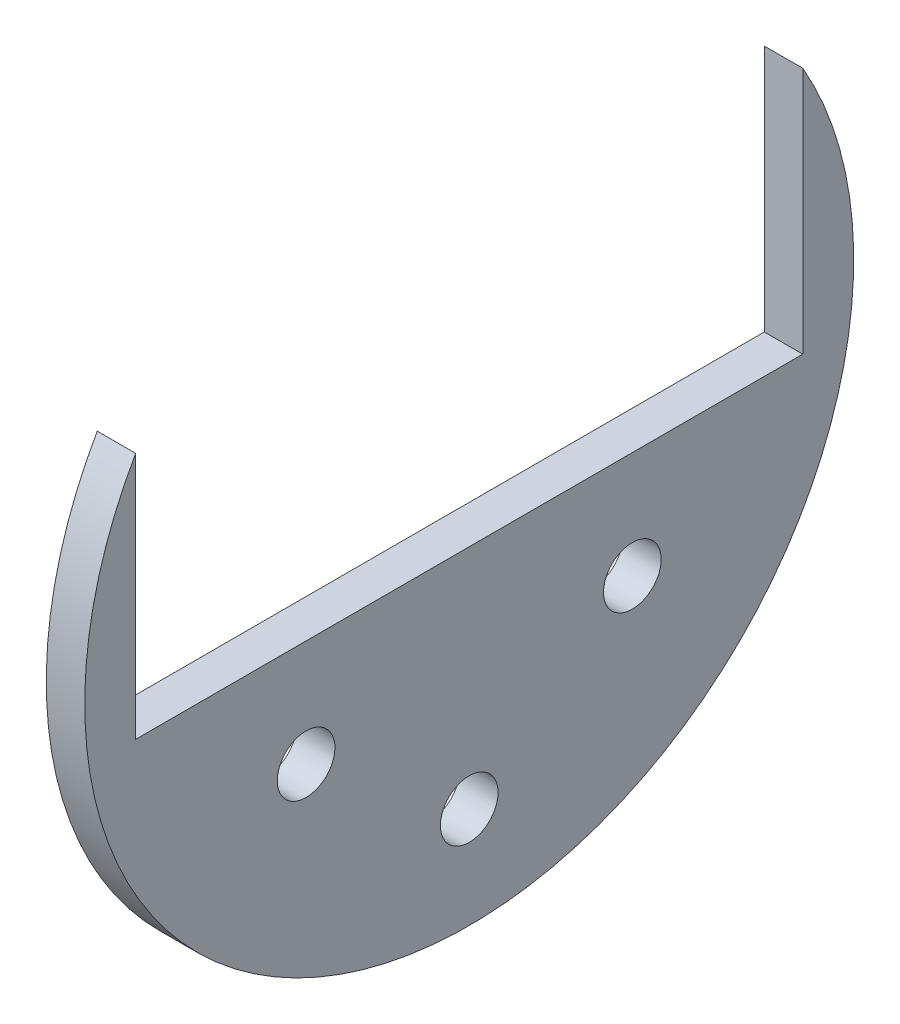
ISO-10303-21;
HEADER;
FILE_DESCRIPTION(('STEP AP214'),'2;1');
FILE_NAME('part.step','',(''),(''),'','','');
FILE_SCHEMA(('AUTOMOTIVE_DESIGN { 1 0 10303 214 1 1 1 1 }'));
ENDSEC;
DATA;
#1=APPLICATION_CONTEXT('core data for automotive mechanical design processes');
#2=APPLICATION_PROTOCOL_DEFINITION('international standard','automotive_design',2000,#1);
#3=PRODUCT_CONTEXT('',#1,'mechanical');
#4=PRODUCT('Part','Part','',(#3));
#5=PRODUCT_RELATED_PRODUCT_CATEGORY('part','',(#4));
#6=PRODUCT_DEFINITION_FORMATION('','',#4);
#7=PRODUCT_DEFINITION_CONTEXT('part definition',#1,'design');
#8=PRODUCT_DEFINITION('design','',#6,#7);
#9=PRODUCT_DEFINITION_SHAPE('','',#8);
#10=(LENGTH_UNIT() NAMED_UNIT(*) SI_UNIT(.MILLI.,.METRE.));
#11=(NAMED_UNIT(*) PLANE_ANGLE_UNIT() SI_UNIT($,.RADIAN.));
#12=(NAMED_UNIT(*) SI_UNIT($,.STERADIAN.) SOLID_ANGLE_UNIT());
#13=UNCERTAINTY_MEASURE_WITH_UNIT(LENGTH_MEASURE(1.E-05),#10,'distance_accuracy_value','');
#14=(GEOMETRIC_REPRESENTATION_CONTEXT(3) GLOBAL_UNCERTAINTY_ASSIGNED_CONTEXT((#13)) GLOBAL_UNIT_ASSIGNED_CONTEXT((#10,
#11,#12)) REPRESENTATION_CONTEXT('',''));
#15=CARTESIAN_POINT('',(0.,0.,0.));
#16=DIRECTION('',(0.,0.,1.));
#17=DIRECTION('',(1.,0.,0.));
#18=AXIS2_PLACEMENT_3D('',#15,#16,#17);
#19=CARTESIAN_POINT('',(2.,-8.48528137423807,-8.48528137423909));
#20=DIRECTION('',(-1.,0.,0.));
#21=DIRECTION('',(0.,0.,1.));
#22=AXIS2_PLACEMENT_3D('',#19,#20,#21);
#23=CYLINDRICAL_SURFACE('',#22,1.50000000000067);
#24=CARTESIAN_POINT('',(2.,-8.48528137423807,-8.48528137423909));
#25=DIRECTION('',(1.,0.,0.));
#26=DIRECTION('',(0.,0.,-1.));
#27=AXIS2_PLACEMENT_3D('',#24,#25,#26);
#28=CIRCLE('',#27,1.50000000000067);
#29=CARTESIAN_POINT('',(2.,-8.48528137423807,-9.98528137423976));
#30=VERTEX_POINT('',#29);
#31=EDGE_CURVE('E50',#30,#30,#28,.T.);
#32=ORIENTED_EDGE('',*,*,#31,.T.);
#33=EDGE_LOOP('',(#32));
#34=FACE_BOUND('',#33,.T.);
#35=CARTESIAN_POINT('',(0.,-8.48528137423807,-8.48528137423909));
#36=DIRECTION('',(1.,0.,0.));
#37=DIRECTION('',(0.,0.,-1.));
#38=AXIS2_PLACEMENT_3D('',#35,#36,#37);
#39=CIRCLE('',#38,1.50000000000067);
#40=CARTESIAN_POINT('',(0.,-8.48528137423807,-9.98528137423976));
#41=VERTEX_POINT('',#40);
#42=EDGE_CURVE('E115',#41,#41,#39,.T.);
#43=ORIENTED_EDGE('',*,*,#42,.F.);
#44=EDGE_LOOP('',(#43));
#45=FACE_BOUND('',#44,.T.);
#46=ADVANCED_FACE('F42',(#34,#45),#23,.F.);
#47=CARTESIAN_POINT('',(2.,-14.75,-8.33021366110691E-13));
#48=DIRECTION('',(-1.,0.,0.));
#49=DIRECTION('',(0.,0.,1.));
#50=AXIS2_PLACEMENT_3D('',#47,#48,#49);
#51=CYLINDRICAL_SURFACE('',#50,1.5000000000009);
#52=CARTESIAN_POINT('',(2.,-14.75,-8.33021366110691E-13));
#53=DIRECTION('',(1.,0.,0.));
#54=DIRECTION('',(0.,0.,-1.));
#55=AXIS2_PLACEMENT_3D('',#52,#53,#54);
#56=CIRCLE('',#55,1.5000000000009);
#57=CARTESIAN_POINT('',(2.,-14.75,-1.50000000000173));
#58=VERTEX_POINT('',#57);
#59=EDGE_CURVE('E114',#58,#58,#56,.T.);
#60=ORIENTED_EDGE('',*,*,#59,.T.);
#61=EDGE_LOOP('',(#60));
#62=FACE_BOUND('',#61,.T.);
#63=CARTESIAN_POINT('',(0.,-14.75,-8.33021366110691E-13));
#64=DIRECTION('',(1.,0.,0.));
#65=DIRECTION('',(0.,0.,-1.));
#66=AXIS2_PLACEMENT_3D('',#63,#64,#65);
#67=CIRCLE('',#66,1.5000000000009);
#68=CARTESIAN_POINT('',(0.,-14.75,-1.50000000000173));
#69=VERTEX_POINT('',#68);
#70=EDGE_CURVE('E125',#69,#69,#67,.T.);
#71=ORIENTED_EDGE('',*,*,#70,.F.);
#72=EDGE_LOOP('',(#71));
#73=FACE_BOUND('',#72,.T.);
#74=ADVANCED_FACE('F133',(#62,#73),#51,.F.);
#75=CARTESIAN_POINT('',(2.,-8.48528137423861,8.48528137423807));
#76=DIRECTION('',(-1.,0.,0.));
#77=DIRECTION('',(0.,0.,1.));
#78=AXIS2_PLACEMENT_3D('',#75,#76,#77);
#79=CYLINDRICAL_SURFACE('',#78,1.50000000000025);
#80=CARTESIAN_POINT('',(2.,-8.48528137423861,8.48528137423807));
#81=DIRECTION('',(1.,0.,0.));
#82=DIRECTION('',(0.,0.,-1.));
#83=AXIS2_PLACEMENT_3D('',#80,#81,#82);
#84=CIRCLE('',#83,1.50000000000025);
#85=CARTESIAN_POINT('',(2.,-8.48528137423861,6.98528137423781));
#86=VERTEX_POINT('',#85);
#87=EDGE_CURVE('E111',#86,#86,#84,.T.);
#88=ORIENTED_EDGE('',*,*,#87,.T.);
#89=EDGE_LOOP('',(#88));
#90=FACE_BOUND('',#89,.T.);
#91=CARTESIAN_POINT('',(0.,-8.48528137423861,8.48528137423807));
#92=DIRECTION('',(1.,0.,0.));
#93=DIRECTION('',(0.,0.,-1.));
#94=AXIS2_PLACEMENT_3D('',#91,#92,#93);
#95=CIRCLE('',#94,1.50000000000025);
#96=CARTESIAN_POINT('',(0.,-8.48528137423861,6.98528137423781));
#97=VERTEX_POINT('',#96);
#98=EDGE_CURVE('E110',#97,#97,#95,.T.);
#99=ORIENTED_EDGE('',*,*,#98,.F.);
#100=EDGE_LOOP('',(#99));
#101=FACE_BOUND('',#100,.T.);
#102=ADVANCED_FACE('F44',(#90,#101),#79,.F.);
#103=CARTESIAN_POINT('',(2.,0.,0.));
#104=DIRECTION('',(1.,0.,0.));
#105=DIRECTION('',(0.,0.,-1.));
#106=AXIS2_PLACEMENT_3D('',#103,#104,#105);
#107=PLANE('',#106);
#108=DIRECTION('',(0.,1.,1.43680443809157E-13));
#109=VECTOR('',#108,1.);
#110=CARTESIAN_POINT('',(2.,-2.933452377906,-17.3500000000016));
#111=LINE('',#110,#109);
#112=CARTESIAN_POINT('',(2.,-2.933452377906,-17.3500000000016));
#113=VERTEX_POINT('',#112);
#114=CARTESIAN_POINT('',(2.,9.94874363927465,-17.3499999999998));
#115=VERTEX_POINT('',#114);
#116=EDGE_CURVE('E99',#113,#115,#111,.T.);
#117=ORIENTED_EDGE('',*,*,#116,.F.);
#118=DIRECTION('',(0.,5.53986691614899E-13,-1.));
#119=VECTOR('',#118,1.);
#120=CARTESIAN_POINT('',(2.,-2.93345237792522,17.3499999999984));
#121=LINE('',#120,#119);
#122=CARTESIAN_POINT('',(2.,-2.93345237792522,17.3499999999984));
#123=VERTEX_POINT('',#122);
#124=EDGE_CURVE('E86',#123,#113,#121,.T.);
#125=ORIENTED_EDGE('',*,*,#124,.F.);
#126=DIRECTION('',(0.,-1.,-1.43851491956549E-13));
#127=VECTOR('',#126,1.);
#128=CARTESIAN_POINT('',(2.,17.3499999999919,17.3500000000013));
#129=LINE('',#128,#127);
#130=CARTESIAN_POINT('',(2.,9.94874363927388,17.3500000000002));
#131=VERTEX_POINT('',#130);
#132=EDGE_CURVE('E103',#131,#123,#129,.T.);
#133=ORIENTED_EDGE('',*,*,#132,.F.);
#134=CARTESIAN_POINT('',(2.,0.,0.));
#135=DIRECTION('',(1.,0.,0.));
#136=DIRECTION('',(0.,0.,-1.));
#137=AXIS2_PLACEMENT_3D('',#134,#135,#136);
#138=CIRCLE('',#137,20.);
#139=EDGE_CURVE('E118',#131,#115,#138,.T.);
#140=ORIENTED_EDGE('',*,*,#139,.T.);
#141=EDGE_LOOP('',(#117,#125,#133,#140));
#142=FACE_BOUND('',#141,.T.);
#143=ORIENTED_EDGE('',*,*,#87,.F.);
#144=EDGE_LOOP('',(#143));
#145=FACE_BOUND('',#144,.T.);
#146=ORIENTED_EDGE('',*,*,#59,.F.);
#147=EDGE_LOOP('',(#146));
#148=FACE_BOUND('',#147,.T.);
#149=ORIENTED_EDGE('',*,*,#31,.F.);
#150=EDGE_LOOP('',(#149));
#151=FACE_BOUND('',#150,.T.);
#152=ADVANCED_FACE('F155',(#142,#145,#148,#151),#107,.T.);
#153=CARTESIAN_POINT('',(0.,0.,0.));
#154=DIRECTION('',(1.,0.,0.));
#155=DIRECTION('',(0.,0.,-1.));
#156=AXIS2_PLACEMENT_3D('',#153,#154,#155);
#157=PLANE('',#156);
#158=ORIENTED_EDGE('',*,*,#98,.T.);
#159=EDGE_LOOP('',(#158));
#160=FACE_BOUND('',#159,.T.);
#161=ORIENTED_EDGE('',*,*,#70,.T.);
#162=EDGE_LOOP('',(#161));
#163=FACE_BOUND('',#162,.T.);
#164=DIRECTION('',(0.,5.53986691614899E-13,-1.));
#165=VECTOR('',#164,1.);
#166=CARTESIAN_POINT('',(0.,-2.93345237792522,17.3499999999984));
#167=LINE('',#166,#165);
#168=CARTESIAN_POINT('',(0.,-2.93345237792522,17.3499999999984));
#169=VERTEX_POINT('',#168);
#170=CARTESIAN_POINT('',(0.,-2.933452377906,-17.3500000000016));
#171=VERTEX_POINT('',#170);
#172=EDGE_CURVE('E57',#169,#171,#167,.T.);
#173=ORIENTED_EDGE('',*,*,#172,.T.);
#174=DIRECTION('',(0.,1.,1.43680443809157E-13));
#175=VECTOR('',#174,1.);
#176=CARTESIAN_POINT('',(0.,-2.933452377906,-17.3500000000016));
#177=LINE('',#176,#175);
#178=CARTESIAN_POINT('',(0.,9.94874363927465,-17.3499999999998));
#179=VERTEX_POINT('',#178);
#180=EDGE_CURVE('E91',#171,#179,#177,.T.);
#181=ORIENTED_EDGE('',*,*,#180,.T.);
#182=CARTESIAN_POINT('',(0.,0.,0.));
#183=DIRECTION('',(1.,0.,0.));
#184=DIRECTION('',(0.,0.,-1.));
#185=AXIS2_PLACEMENT_3D('',#182,#183,#184);
#186=CIRCLE('',#185,20.);
#187=CARTESIAN_POINT('',(0.,9.94874363927388,17.3500000000002));
#188=VERTEX_POINT('',#187);
#189=EDGE_CURVE('E128',#188,#179,#186,.T.);
#190=ORIENTED_EDGE('',*,*,#189,.F.);
#191=DIRECTION('',(0.,-1.,-1.43851491956549E-13));
#192=VECTOR('',#191,1.);
#193=CARTESIAN_POINT('',(0.,-2.49582338544595E-12,17.3499999999988));
#194=LINE('',#193,#192);
#195=EDGE_CURVE('E11',#188,#169,#194,.T.);
#196=ORIENTED_EDGE('',*,*,#195,.T.);
#197=EDGE_LOOP('',(#173,#181,#190,#196));
#198=FACE_BOUND('',#197,.T.);
#199=ORIENTED_EDGE('',*,*,#42,.T.);
#200=EDGE_LOOP('',(#199));
#201=FACE_BOUND('',#200,.T.);
#202=ADVANCED_FACE('F97',(#160,#163,#198,#201),#157,.F.);
#203=CARTESIAN_POINT('',(2.,0.,0.));
#204=DIRECTION('',(-1.,0.,0.));
#205=DIRECTION('',(0.,0.,1.));
#206=AXIS2_PLACEMENT_3D('',#203,#204,#205);
#207=CYLINDRICAL_SURFACE('',#206,20.);
#208=ORIENTED_EDGE('',*,*,#189,.T.);
#209=DIRECTION('',(-1.,0.,0.));
#210=VECTOR('',#209,1.);
#211=CARTESIAN_POINT('',(2.,9.94874363927465,-17.3499999999998));
#212=LINE('',#211,#210);
#213=EDGE_CURVE('E65',#179,#115,#212,.F.);
#214=ORIENTED_EDGE('',*,*,#213,.T.);
#215=ORIENTED_EDGE('',*,*,#139,.F.);
#216=DIRECTION('',(-1.,0.,0.));
#217=VECTOR('',#216,1.);
#218=CARTESIAN_POINT('',(2.,9.94874363927388,17.3500000000002));
#219=LINE('',#218,#217);
#220=EDGE_CURVE('E88',#131,#188,#219,.T.);
#221=ORIENTED_EDGE('',*,*,#220,.T.);
#222=EDGE_LOOP('',(#208,#214,#215,#221));
#223=FACE_BOUND('',#222,.T.);
#224=ADVANCED_FACE('F145',(#223),#207,.T.);
#225=CARTESIAN_POINT('',(0.,17.3499999999919,17.3500000000013));
#226=DIRECTION('',(0.,-1.43851491956549E-13,1.));
#227=DIRECTION('',(0.,-1.,-1.43851491956549E-13));
#228=AXIS2_PLACEMENT_3D('',#225,#226,#227);
#229=PLANE('',#228);
#230=ORIENTED_EDGE('',*,*,#132,.T.);
#231=DIRECTION('',(1.,0.,0.));
#232=VECTOR('',#231,1.);
#233=CARTESIAN_POINT('',(0.,-2.93345237792522,17.3499999999984));
#234=LINE('',#233,#232);
#235=EDGE_CURVE('E89',#169,#123,#234,.T.);
#236=ORIENTED_EDGE('',*,*,#235,.F.);
#237=ORIENTED_EDGE('',*,*,#195,.F.);
#238=ORIENTED_EDGE('',*,*,#220,.F.);
#239=EDGE_LOOP('',(#230,#236,#237,#238));
#240=FACE_BOUND('',#239,.T.);
#241=ADVANCED_FACE('F147',(#240),#229,.F.);
#242=CARTESIAN_POINT('',(0.,-2.93345237792522,17.3499999999984));
#243=DIRECTION('',(0.,-1.,-5.53986691614899E-13));
#244=DIRECTION('',(0.,5.53986691614899E-13,-1.));
#245=AXIS2_PLACEMENT_3D('',#242,#243,#244);
#246=PLANE('',#245);
#247=ORIENTED_EDGE('',*,*,#124,.T.);
#248=DIRECTION('',(1.,0.,0.));
#249=VECTOR('',#248,1.);
#250=CARTESIAN_POINT('',(0.,-2.933452377906,-17.3500000000016));
#251=LINE('',#250,#249);
#252=EDGE_CURVE('E83',#171,#113,#251,.T.);
#253=ORIENTED_EDGE('',*,*,#252,.F.);
#254=ORIENTED_EDGE('',*,*,#172,.F.);
#255=ORIENTED_EDGE('',*,*,#235,.T.);
#256=EDGE_LOOP('',(#247,#253,#254,#255));
#257=FACE_BOUND('',#256,.T.);
#258=ADVANCED_FACE('F84',(#257),#246,.F.);
#259=CARTESIAN_POINT('',(0.,-2.933452377906,-17.3500000000016));
#260=DIRECTION('',(0.,1.43680443809157E-13,-1.));
#261=DIRECTION('',(0.,1.,1.43680443809157E-13));
#262=AXIS2_PLACEMENT_3D('',#259,#260,#261);
#263=PLANE('',#262);
#264=ORIENTED_EDGE('',*,*,#180,.F.);
#265=ORIENTED_EDGE('',*,*,#252,.T.);
#266=ORIENTED_EDGE('',*,*,#116,.T.);
#267=ORIENTED_EDGE('',*,*,#213,.F.);
#268=EDGE_LOOP('',(#264,#265,#266,#267));
#269=FACE_BOUND('',#268,.T.);
#270=ADVANCED_FACE('F92',(#269),#263,.F.);
#271=CLOSED_SHELL('',(#46,#74,#102,#152,#202,#224,#241,#258,#270));
#272=MANIFOLD_SOLID_BREP('B2',#271);
#273=ADVANCED_BREP_SHAPE_REPRESENTATION('',(#18,#272),#14);
#274=SHAPE_DEFINITION_REPRESENTATION(#9,#273);
ENDSEC;
END-ISO-10303-21;
